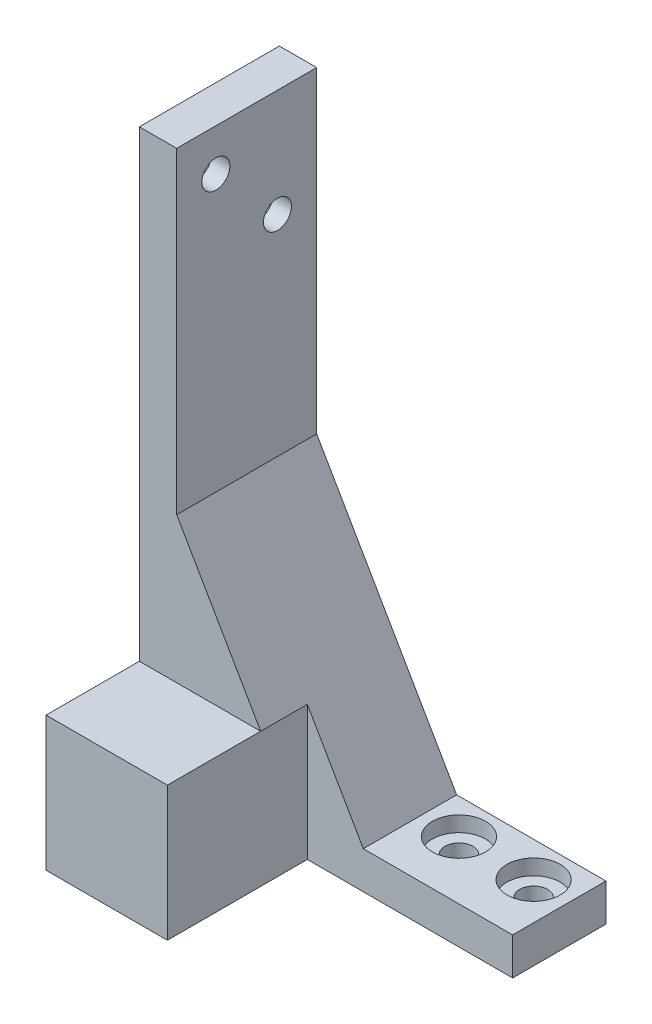
ISO-10303-21;
HEADER;
FILE_DESCRIPTION(('STEP AP214'),'2;1');
FILE_NAME('part.step','',(''),(''),'','','');
FILE_SCHEMA(('AUTOMOTIVE_DESIGN { 1 0 10303 214 1 1 1 1 }'));
ENDSEC;
DATA;
#1=APPLICATION_CONTEXT('core data for automotive mechanical design processes');
#2=APPLICATION_PROTOCOL_DEFINITION('international standard','automotive_design',2000,#1);
#3=PRODUCT_CONTEXT('',#1,'mechanical');
#4=PRODUCT('Part','Part','',(#3));
#5=PRODUCT_RELATED_PRODUCT_CATEGORY('part','',(#4));
#6=PRODUCT_DEFINITION_FORMATION('','',#4);
#7=PRODUCT_DEFINITION_CONTEXT('part definition',#1,'design');
#8=PRODUCT_DEFINITION('design','',#6,#7);
#9=PRODUCT_DEFINITION_SHAPE('','',#8);
#10=(LENGTH_UNIT() NAMED_UNIT(*) SI_UNIT(.MILLI.,.METRE.));
#11=(NAMED_UNIT(*) PLANE_ANGLE_UNIT() SI_UNIT($,.RADIAN.));
#12=(NAMED_UNIT(*) SI_UNIT($,.STERADIAN.) SOLID_ANGLE_UNIT());
#13=UNCERTAINTY_MEASURE_WITH_UNIT(LENGTH_MEASURE(1.E-05),#10,'distance_accuracy_value','');
#14=(GEOMETRIC_REPRESENTATION_CONTEXT(3) GLOBAL_UNCERTAINTY_ASSIGNED_CONTEXT((#13)) GLOBAL_UNIT_ASSIGNED_CONTEXT((#10,
#11,#12)) REPRESENTATION_CONTEXT('',''));
#15=CARTESIAN_POINT('',(0.,0.,0.));
#16=DIRECTION('',(0.,0.,1.));
#17=DIRECTION('',(1.,0.,0.));
#18=AXIS2_PLACEMENT_3D('',#15,#16,#17);
#19=CARTESIAN_POINT('',(17.5,4.,7.5));
#20=DIRECTION('',(0.,0.,-1.));
#21=DIRECTION('',(-1.,0.,0.));
#22=AXIS2_PLACEMENT_3D('',#19,#20,#21);
#23=PLANE('',#22);
#24=DIRECTION('',(-1.,0.,0.));
#25=VECTOR('',#24,1.);
#26=CARTESIAN_POINT('',(-4.49999999999999,14.4,7.5));
#27=LINE('',#26,#25);
#28=CARTESIAN_POINT('',(-4.49999999999999,14.4,7.5));
#29=VERTEX_POINT('',#28);
#30=CARTESIAN_POINT('',(-17.5,14.4,7.5));
#31=VERTEX_POINT('',#30);
#32=EDGE_CURVE('E152',#29,#31,#27,.T.);
#33=ORIENTED_EDGE('',*,*,#32,.F.);
#34=DIRECTION('',(-0.499722453489577,0.8661855860486,0.));
#35=VECTOR('',#34,1.);
#36=CARTESIAN_POINT('',(1.50000000000001,4.,7.5));
#37=LINE('',#36,#35);
#38=CARTESIAN_POINT('',(-13.5,30.,7.5));
#39=VERTEX_POINT('',#38);
#40=EDGE_CURVE('E202',#29,#39,#37,.T.);
#41=ORIENTED_EDGE('',*,*,#40,.T.);
#42=DIRECTION('',(0.,-1.,0.));
#43=VECTOR('',#42,1.);
#44=CARTESIAN_POINT('',(-13.5,64.,7.5));
#45=LINE('',#44,#43);
#46=CARTESIAN_POINT('',(-13.5,64.,7.5));
#47=VERTEX_POINT('',#46);
#48=EDGE_CURVE('E224',#47,#39,#45,.T.);
#49=ORIENTED_EDGE('',*,*,#48,.F.);
#50=DIRECTION('',(1.,0.,0.));
#51=VECTOR('',#50,1.);
#52=CARTESIAN_POINT('',(-17.5,64.,7.5));
#53=LINE('',#52,#51);
#54=CARTESIAN_POINT('',(-17.5,64.,7.5));
#55=VERTEX_POINT('',#54);
#56=EDGE_CURVE('E216',#55,#47,#53,.T.);
#57=ORIENTED_EDGE('',*,*,#56,.F.);
#58=DIRECTION('',(0.,-1.,0.));
#59=VECTOR('',#58,1.);
#60=CARTESIAN_POINT('',(-17.5,4.,7.5));
#61=LINE('',#60,#59);
#62=EDGE_CURVE('E244',#55,#31,#61,.T.);
#63=ORIENTED_EDGE('',*,*,#62,.T.);
#64=EDGE_LOOP('',(#33,#41,#49,#57,#63));
#65=FACE_BOUND('',#64,.T.);
#66=ADVANCED_FACE('F35',(#65),#23,.F.);
#67=CARTESIAN_POINT('',(-17.501,52.48,-3.29999999999999));
#68=DIRECTION('',(1.,0.,0.));
#69=DIRECTION('',(0.,0.,-1.));
#70=AXIS2_PLACEMENT_3D('',#67,#68,#69);
#71=CYLINDRICAL_SURFACE('',#70,1.5);
#72=CARTESIAN_POINT('',(-13.5,52.48,-3.3));
#73=DIRECTION('',(1.,0.,0.));
#74=DIRECTION('',(0.,0.,-1.));
#75=AXIS2_PLACEMENT_3D('',#72,#73,#74);
#76=CIRCLE('',#75,1.5);
#77=CARTESIAN_POINT('',(-13.5,52.48,-4.8));
#78=VERTEX_POINT('',#77);
#79=EDGE_CURVE('E178',#78,#78,#76,.T.);
#80=ORIENTED_EDGE('',*,*,#79,.T.);
#81=EDGE_LOOP('',(#80));
#82=FACE_BOUND('',#81,.T.);
#83=CARTESIAN_POINT('',(-15.5,52.48,-3.3));
#84=DIRECTION('',(-1.,0.,0.));
#85=DIRECTION('',(0.,0.,1.));
#86=AXIS2_PLACEMENT_3D('',#83,#84,#85);
#87=CIRCLE('',#86,1.5);
#88=CARTESIAN_POINT('',(-15.5,52.48,-1.79999999999999));
#89=VERTEX_POINT('',#88);
#90=EDGE_CURVE('E39',#89,#89,#87,.F.);
#91=ORIENTED_EDGE('',*,*,#90,.F.);
#92=EDGE_LOOP('',(#91));
#93=FACE_BOUND('',#92,.T.);
#94=ADVANCED_FACE('F258',(#82,#93),#71,.F.);
#95=CARTESIAN_POINT('',(-17.501,59.52,3.3));
#96=DIRECTION('',(1.,0.,0.));
#97=DIRECTION('',(0.,0.,-1.));
#98=AXIS2_PLACEMENT_3D('',#95,#96,#97);
#99=CYLINDRICAL_SURFACE('',#98,1.5);
#100=CARTESIAN_POINT('',(-13.5,59.52,3.3));
#101=DIRECTION('',(1.,0.,0.));
#102=DIRECTION('',(0.,0.,-1.));
#103=AXIS2_PLACEMENT_3D('',#100,#101,#102);
#104=CIRCLE('',#103,1.5);
#105=CARTESIAN_POINT('',(-13.5,59.52,1.8));
#106=VERTEX_POINT('',#105);
#107=EDGE_CURVE('E174',#106,#106,#104,.T.);
#108=ORIENTED_EDGE('',*,*,#107,.T.);
#109=EDGE_LOOP('',(#108));
#110=FACE_BOUND('',#109,.T.);
#111=CARTESIAN_POINT('',(-15.5,59.52,3.3));
#112=DIRECTION('',(-1.,0.,0.));
#113=DIRECTION('',(0.,0.,1.));
#114=AXIS2_PLACEMENT_3D('',#111,#112,#113);
#115=CIRCLE('',#114,1.5);
#116=CARTESIAN_POINT('',(-15.5,59.52,4.8));
#117=VERTEX_POINT('',#116);
#118=EDGE_CURVE('E168',#117,#117,#115,.F.);
#119=ORIENTED_EDGE('',*,*,#118,.F.);
#120=EDGE_LOOP('',(#119));
#121=FACE_BOUND('',#120,.T.);
#122=ADVANCED_FACE('F260',(#110,#121),#99,.F.);
#123=CARTESIAN_POINT('',(5.50000000000001,4.,-3.75));
#124=DIRECTION('',(0.,-1.,0.));
#125=DIRECTION('',(0.,0.,-1.));
#126=AXIS2_PLACEMENT_3D('',#123,#124,#125);
#127=CYLINDRICAL_SURFACE('',#126,1.5);
#128=CARTESIAN_POINT('',(5.50000000000001,0.,-3.75));
#129=DIRECTION('',(0.,1.,0.));
#130=DIRECTION('',(0.,0.,1.));
#131=AXIS2_PLACEMENT_3D('',#128,#129,#130);
#132=CIRCLE('',#131,1.5);
#133=CARTESIAN_POINT('',(5.50000000000001,0.,-2.25));
#134=VERTEX_POINT('',#133);
#135=EDGE_CURVE('E230',#134,#134,#132,.T.);
#136=ORIENTED_EDGE('',*,*,#135,.F.);
#137=EDGE_LOOP('',(#136));
#138=FACE_BOUND('',#137,.T.);
#139=CARTESIAN_POINT('',(5.50000000000001,2.35,-3.75));
#140=DIRECTION('',(0.,1.,0.));
#141=DIRECTION('',(0.,0.,1.));
#142=AXIS2_PLACEMENT_3D('',#139,#140,#141);
#143=CIRCLE('',#142,1.5);
#144=CARTESIAN_POINT('',(5.50000000000001,2.35,-2.25));
#145=VERTEX_POINT('',#144);
#146=EDGE_CURVE('E205',#145,#145,#143,.T.);
#147=ORIENTED_EDGE('',*,*,#146,.T.);
#148=EDGE_LOOP('',(#147));
#149=FACE_BOUND('',#148,.T.);
#150=ADVANCED_FACE('F267',(#138,#149),#127,.F.);
#151=CARTESIAN_POINT('',(13.5,4.,-3.75));
#152=DIRECTION('',(0.,-1.,0.));
#153=DIRECTION('',(0.,0.,-1.));
#154=AXIS2_PLACEMENT_3D('',#151,#152,#153);
#155=CYLINDRICAL_SURFACE('',#154,1.5);
#156=CARTESIAN_POINT('',(13.5,0.,-3.75));
#157=DIRECTION('',(0.,1.,0.));
#158=DIRECTION('',(0.,0.,1.));
#159=AXIS2_PLACEMENT_3D('',#156,#157,#158);
#160=CIRCLE('',#159,1.5);
#161=CARTESIAN_POINT('',(13.5,0.,-2.25));
#162=VERTEX_POINT('',#161);
#163=EDGE_CURVE('E227',#162,#162,#160,.T.);
#164=ORIENTED_EDGE('',*,*,#163,.F.);
#165=EDGE_LOOP('',(#164));
#166=FACE_BOUND('',#165,.T.);
#167=CARTESIAN_POINT('',(13.5,2.35,-3.75));
#168=DIRECTION('',(0.,1.,0.));
#169=DIRECTION('',(0.,0.,1.));
#170=AXIS2_PLACEMENT_3D('',#167,#168,#169);
#171=CIRCLE('',#170,1.5);
#172=CARTESIAN_POINT('',(13.5,2.35,-2.25));
#173=VERTEX_POINT('',#172);
#174=EDGE_CURVE('E193',#173,#173,#171,.T.);
#175=ORIENTED_EDGE('',*,*,#174,.T.);
#176=EDGE_LOOP('',(#175));
#177=FACE_BOUND('',#176,.T.);
#178=ADVANCED_FACE('F308',(#166,#177),#155,.F.);
#179=CARTESIAN_POINT('',(0.,4.,0.));
#180=DIRECTION('',(0.,1.,0.));
#181=DIRECTION('',(0.,0.,1.));
#182=AXIS2_PLACEMENT_3D('',#179,#180,#181);
#183=PLANE('',#182);
#184=DIRECTION('',(-1.,0.,0.));
#185=VECTOR('',#184,1.);
#186=CARTESIAN_POINT('',(0.,4.,2.5));
#187=LINE('',#186,#185);
#188=CARTESIAN_POINT('',(17.5,4.,2.5));
#189=VERTEX_POINT('',#188);
#190=CARTESIAN_POINT('',(1.50000000000001,4.,2.5));
#191=VERTEX_POINT('',#190);
#192=EDGE_CURVE('E187',#189,#191,#187,.T.);
#193=ORIENTED_EDGE('',*,*,#192,.F.);
#194=DIRECTION('',(0.,0.,-1.));
#195=VECTOR('',#194,1.);
#196=CARTESIAN_POINT('',(17.5,4.,7.5));
#197=LINE('',#196,#195);
#198=CARTESIAN_POINT('',(17.5,4.,-7.5));
#199=VERTEX_POINT('',#198);
#200=EDGE_CURVE('E60',#189,#199,#197,.T.);
#201=ORIENTED_EDGE('',*,*,#200,.T.);
#202=DIRECTION('',(-1.,0.,0.));
#203=VECTOR('',#202,1.);
#204=CARTESIAN_POINT('',(17.5,4.,-7.5));
#205=LINE('',#204,#203);
#206=CARTESIAN_POINT('',(1.50000000000001,4.,-7.5));
#207=VERTEX_POINT('',#206);
#208=EDGE_CURVE('E235',#199,#207,#205,.T.);
#209=ORIENTED_EDGE('',*,*,#208,.T.);
#210=DIRECTION('',(0.,0.,1.));
#211=VECTOR('',#210,1.);
#212=CARTESIAN_POINT('',(1.50000000000001,4.,-37.5166620396073));
#213=LINE('',#212,#211);
#214=EDGE_CURVE('E204',#207,#191,#213,.T.);
#215=ORIENTED_EDGE('',*,*,#214,.T.);
#216=EDGE_LOOP('',(#193,#201,#209,#215));
#217=FACE_BOUND('',#216,.T.);
#218=CARTESIAN_POINT('',(5.50000000000001,4.,-3.75));
#219=DIRECTION('',(0.,1.,0.));
#220=DIRECTION('',(0.,0.,1.));
#221=AXIS2_PLACEMENT_3D('',#218,#219,#220);
#222=CIRCLE('',#221,2.85);
#223=CARTESIAN_POINT('',(5.50000000000001,4.,-0.899999999999999));
#224=VERTEX_POINT('',#223);
#225=EDGE_CURVE('E194',#224,#224,#222,.T.);
#226=ORIENTED_EDGE('',*,*,#225,.F.);
#227=EDGE_LOOP('',(#226));
#228=FACE_BOUND('',#227,.T.);
#229=CARTESIAN_POINT('',(13.5,4.,-3.75));
#230=DIRECTION('',(0.,1.,0.));
#231=DIRECTION('',(0.,0.,1.));
#232=AXIS2_PLACEMENT_3D('',#229,#230,#231);
#233=CIRCLE('',#232,2.85);
#234=CARTESIAN_POINT('',(13.5,4.,-0.9));
#235=VERTEX_POINT('',#234);
#236=EDGE_CURVE('E189',#235,#235,#233,.T.);
#237=ORIENTED_EDGE('',*,*,#236,.F.);
#238=EDGE_LOOP('',(#237));
#239=FACE_BOUND('',#238,.T.);
#240=ADVANCED_FACE('F311',(#217,#228,#239),#183,.T.);
#241=CARTESIAN_POINT('',(0.,0.,0.));
#242=DIRECTION('',(0.,1.,0.));
#243=DIRECTION('',(0.,0.,1.));
#244=AXIS2_PLACEMENT_3D('',#241,#242,#243);
#245=PLANE('',#244);
#246=DIRECTION('',(0.,0.,-1.));
#247=VECTOR('',#246,1.);
#248=CARTESIAN_POINT('',(17.5,0.,7.5));
#249=LINE('',#248,#247);
#250=CARTESIAN_POINT('',(17.5,0.,2.5));
#251=VERTEX_POINT('',#250);
#252=CARTESIAN_POINT('',(17.5,0.,-7.5));
#253=VERTEX_POINT('',#252);
#254=EDGE_CURVE('E72',#251,#253,#249,.T.);
#255=ORIENTED_EDGE('',*,*,#254,.F.);
#256=DIRECTION('',(1.,0.,0.));
#257=VECTOR('',#256,1.);
#258=CARTESIAN_POINT('',(-4.49999999999999,0.,2.5));
#259=LINE('',#258,#257);
#260=CARTESIAN_POINT('',(-4.49999999999999,0.,2.5));
#261=VERTEX_POINT('',#260);
#262=EDGE_CURVE('E184',#261,#251,#259,.T.);
#263=ORIENTED_EDGE('',*,*,#262,.F.);
#264=DIRECTION('',(0.,0.,-1.));
#265=VECTOR('',#264,1.);
#266=CARTESIAN_POINT('',(-4.49999999999999,0.,7.5));
#267=LINE('',#266,#265);
#268=CARTESIAN_POINT('',(-4.49999999999998,0.,17.5));
#269=VERTEX_POINT('',#268);
#270=EDGE_CURVE('E181',#269,#261,#267,.T.);
#271=ORIENTED_EDGE('',*,*,#270,.F.);
#272=DIRECTION('',(1.,0.,0.));
#273=VECTOR('',#272,1.);
#274=CARTESIAN_POINT('',(-4.49999999999998,0.,17.5));
#275=LINE('',#274,#273);
#276=CARTESIAN_POINT('',(-17.5,0.,17.5));
#277=VERTEX_POINT('',#276);
#278=EDGE_CURVE('E151',#277,#269,#275,.T.);
#279=ORIENTED_EDGE('',*,*,#278,.F.);
#280=DIRECTION('',(0.,0.,1.));
#281=VECTOR('',#280,1.);
#282=CARTESIAN_POINT('',(-17.5,0.,7.5));
#283=LINE('',#282,#281);
#284=CARTESIAN_POINT('',(-17.5,0.,-7.49999999999999));
#285=VERTEX_POINT('',#284);
#286=EDGE_CURVE('E233',#285,#277,#283,.T.);
#287=ORIENTED_EDGE('',*,*,#286,.F.);
#288=DIRECTION('',(-1.,0.,0.));
#289=VECTOR('',#288,1.);
#290=CARTESIAN_POINT('',(17.5,0.,-7.5));
#291=LINE('',#290,#289);
#292=EDGE_CURVE('E236',#253,#285,#291,.T.);
#293=ORIENTED_EDGE('',*,*,#292,.F.);
#294=EDGE_LOOP('',(#255,#263,#271,#279,#287,#293));
#295=FACE_BOUND('',#294,.T.);
#296=ORIENTED_EDGE('',*,*,#135,.T.);
#297=EDGE_LOOP('',(#296));
#298=FACE_BOUND('',#297,.T.);
#299=ORIENTED_EDGE('',*,*,#163,.T.);
#300=EDGE_LOOP('',(#299));
#301=FACE_BOUND('',#300,.T.);
#302=ADVANCED_FACE('F318',(#295,#298,#301),#245,.F.);
#303=CARTESIAN_POINT('',(-17.5,4.,7.5));
#304=DIRECTION('',(1.,0.,0.));
#305=DIRECTION('',(0.,0.,-1.));
#306=AXIS2_PLACEMENT_3D('',#303,#304,#305);
#307=PLANE('',#306);
#308=CARTESIAN_POINT('',(-17.5,52.48,-3.29999999999999));
#309=DIRECTION('',(-1.,0.,0.));
#310=DIRECTION('',(0.,0.,1.));
#311=AXIS2_PLACEMENT_3D('',#308,#309,#310);
#312=CIRCLE('',#311,2.5);
#313=CARTESIAN_POINT('',(-17.5,52.48,-0.799999999999993));
#314=VERTEX_POINT('',#313);
#315=EDGE_CURVE('E169',#314,#314,#312,.T.);
#316=ORIENTED_EDGE('',*,*,#315,.F.);
#317=EDGE_LOOP('',(#316));
#318=FACE_BOUND('',#317,.T.);
#319=CARTESIAN_POINT('',(-17.5,59.52,3.3));
#320=DIRECTION('',(-1.,0.,0.));
#321=DIRECTION('',(0.,0.,1.));
#322=AXIS2_PLACEMENT_3D('',#319,#320,#321);
#323=CIRCLE('',#322,2.5);
#324=CARTESIAN_POINT('',(-17.5,59.52,5.8));
#325=VERTEX_POINT('',#324);
#326=EDGE_CURVE('E157',#325,#325,#323,.T.);
#327=ORIENTED_EDGE('',*,*,#326,.F.);
#328=EDGE_LOOP('',(#327));
#329=FACE_BOUND('',#328,.T.);
#330=ORIENTED_EDGE('',*,*,#286,.T.);
#331=DIRECTION('',(0.,-1.,0.));
#332=VECTOR('',#331,1.);
#333=CARTESIAN_POINT('',(-17.5,14.4,17.5));
#334=LINE('',#333,#332);
#335=CARTESIAN_POINT('',(-17.5,14.4,17.5));
#336=VERTEX_POINT('',#335);
#337=EDGE_CURVE('E144',#336,#277,#334,.T.);
#338=ORIENTED_EDGE('',*,*,#337,.F.);
#339=DIRECTION('',(0.,0.,-1.));
#340=VECTOR('',#339,1.);
#341=CARTESIAN_POINT('',(-17.5,14.4,17.5));
#342=LINE('',#341,#340);
#343=EDGE_CURVE('E140',#336,#31,#342,.T.);
#344=ORIENTED_EDGE('',*,*,#343,.T.);
#345=ORIENTED_EDGE('',*,*,#62,.F.);
#346=DIRECTION('',(0.,0.,1.));
#347=VECTOR('',#346,1.);
#348=CARTESIAN_POINT('',(-17.5,64.,-7.49999999999999));
#349=LINE('',#348,#347);
#350=CARTESIAN_POINT('',(-17.5,64.,-7.49999999999999));
#351=VERTEX_POINT('',#350);
#352=EDGE_CURVE('E213',#351,#55,#349,.T.);
#353=ORIENTED_EDGE('',*,*,#352,.F.);
#354=DIRECTION('',(0.,-1.,0.));
#355=VECTOR('',#354,1.);
#356=CARTESIAN_POINT('',(-17.5,4.,-7.49999999999999));
#357=LINE('',#356,#355);
#358=EDGE_CURVE('E79',#351,#285,#357,.T.);
#359=ORIENTED_EDGE('',*,*,#358,.T.);
#360=EDGE_LOOP('',(#330,#338,#344,#345,#353,#359));
#361=FACE_BOUND('',#360,.T.);
#362=ADVANCED_FACE('F37',(#318,#329,#361),#307,.F.);
#363=CARTESIAN_POINT('',(17.5,4.,7.5));
#364=DIRECTION('',(-1.,0.,0.));
#365=DIRECTION('',(0.,0.,1.));
#366=AXIS2_PLACEMENT_3D('',#363,#364,#365);
#367=PLANE('',#366);
#368=ORIENTED_EDGE('',*,*,#200,.F.);
#369=DIRECTION('',(0.,1.,0.));
#370=VECTOR('',#369,1.);
#371=CARTESIAN_POINT('',(17.5,0.,2.5));
#372=LINE('',#371,#370);
#373=EDGE_CURVE('E177',#251,#189,#372,.T.);
#374=ORIENTED_EDGE('',*,*,#373,.F.);
#375=ORIENTED_EDGE('',*,*,#254,.T.);
#376=DIRECTION('',(0.,-1.,0.));
#377=VECTOR('',#376,1.);
#378=CARTESIAN_POINT('',(17.5,4.,-7.5));
#379=LINE('',#378,#377);
#380=EDGE_CURVE('E242',#199,#253,#379,.T.);
#381=ORIENTED_EDGE('',*,*,#380,.F.);
#382=EDGE_LOOP('',(#368,#374,#375,#381));
#383=FACE_BOUND('',#382,.T.);
#384=ADVANCED_FACE('F324',(#383),#367,.F.);
#385=CARTESIAN_POINT('',(17.5,4.,-7.5));
#386=DIRECTION('',(0.,0.,1.));
#387=DIRECTION('',(1.,0.,0.));
#388=AXIS2_PLACEMENT_3D('',#385,#386,#387);
#389=PLANE('',#388);
#390=ORIENTED_EDGE('',*,*,#292,.T.);
#391=ORIENTED_EDGE('',*,*,#358,.F.);
#392=DIRECTION('',(-1.,0.,0.));
#393=VECTOR('',#392,1.);
#394=CARTESIAN_POINT('',(-17.5,64.,-7.49999999999999));
#395=LINE('',#394,#393);
#396=CARTESIAN_POINT('',(-13.5,64.,-7.49999999999999));
#397=VERTEX_POINT('',#396);
#398=EDGE_CURVE('E219',#397,#351,#395,.T.);
#399=ORIENTED_EDGE('',*,*,#398,.F.);
#400=DIRECTION('',(0.,-1.,0.));
#401=VECTOR('',#400,1.);
#402=CARTESIAN_POINT('',(-13.5,64.,-7.49999999999999));
#403=LINE('',#402,#401);
#404=CARTESIAN_POINT('',(-13.5,30.,-7.49999999999999));
#405=VERTEX_POINT('',#404);
#406=EDGE_CURVE('E221',#397,#405,#403,.T.);
#407=ORIENTED_EDGE('',*,*,#406,.T.);
#408=DIRECTION('',(0.499722453489577,-0.866185586048601,0.));
#409=VECTOR('',#408,1.);
#410=CARTESIAN_POINT('',(1.50000000000001,4.,-7.5));
#411=LINE('',#410,#409);
#412=EDGE_CURVE('E209',#405,#207,#411,.T.);
#413=ORIENTED_EDGE('',*,*,#412,.T.);
#414=ORIENTED_EDGE('',*,*,#208,.F.);
#415=ORIENTED_EDGE('',*,*,#380,.T.);
#416=EDGE_LOOP('',(#390,#391,#399,#407,#413,#414,#415));
#417=FACE_BOUND('',#416,.T.);
#418=ADVANCED_FACE('F306',(#417),#389,.F.);
#419=CARTESIAN_POINT('',(-13.5,64.,-7.49999999999999));
#420=DIRECTION('',(-1.,0.,0.));
#421=DIRECTION('',(0.,0.,1.));
#422=AXIS2_PLACEMENT_3D('',#419,#420,#421);
#423=PLANE('',#422);
#424=ORIENTED_EDGE('',*,*,#107,.F.);
#425=EDGE_LOOP('',(#424));
#426=FACE_BOUND('',#425,.T.);
#427=ORIENTED_EDGE('',*,*,#79,.F.);
#428=EDGE_LOOP('',(#427));
#429=FACE_BOUND('',#428,.T.);
#430=ORIENTED_EDGE('',*,*,#48,.T.);
#431=DIRECTION('',(0.,0.,1.));
#432=VECTOR('',#431,1.);
#433=CARTESIAN_POINT('',(-13.5,30.,-37.5166620396073));
#434=LINE('',#433,#432);
#435=EDGE_CURVE('E206',#405,#39,#434,.T.);
#436=ORIENTED_EDGE('',*,*,#435,.F.);
#437=ORIENTED_EDGE('',*,*,#406,.F.);
#438=DIRECTION('',(0.,0.,-1.));
#439=VECTOR('',#438,1.);
#440=CARTESIAN_POINT('',(-13.5,64.,-7.49999999999999));
#441=LINE('',#440,#439);
#442=EDGE_CURVE('E86',#47,#397,#441,.T.);
#443=ORIENTED_EDGE('',*,*,#442,.F.);
#444=EDGE_LOOP('',(#430,#436,#437,#443));
#445=FACE_BOUND('',#444,.T.);
#446=ADVANCED_FACE('F303',(#426,#429,#445),#423,.F.);
#447=CARTESIAN_POINT('',(0.,64.,0.));
#448=DIRECTION('',(0.,1.,0.));
#449=DIRECTION('',(0.,0.,1.));
#450=AXIS2_PLACEMENT_3D('',#447,#448,#449);
#451=PLANE('',#450);
#452=ORIENTED_EDGE('',*,*,#352,.T.);
#453=ORIENTED_EDGE('',*,*,#56,.T.);
#454=ORIENTED_EDGE('',*,*,#442,.T.);
#455=ORIENTED_EDGE('',*,*,#398,.T.);
#456=EDGE_LOOP('',(#452,#453,#454,#455));
#457=FACE_BOUND('',#456,.T.);
#458=ADVANCED_FACE('F299',(#457),#451,.T.);
#459=CARTESIAN_POINT('',(1.50000000000001,4.,-37.5166620396073));
#460=DIRECTION('',(0.866185586048601,0.499722453489577,0.));
#461=DIRECTION('',(-0.499722453489577,0.866185586048601,0.));
#462=AXIS2_PLACEMENT_3D('',#459,#460,#461);
#463=PLANE('',#462);
#464=DIRECTION('',(-0.499722453489577,0.866185586048601,0.));
#465=VECTOR('',#464,1.);
#466=CARTESIAN_POINT('',(1.50000000000001,4.,2.5));
#467=LINE('',#466,#465);
#468=CARTESIAN_POINT('',(-4.49999999999999,14.4,2.5));
#469=VERTEX_POINT('',#468);
#470=EDGE_CURVE('E11',#191,#469,#467,.T.);
#471=ORIENTED_EDGE('',*,*,#470,.F.);
#472=ORIENTED_EDGE('',*,*,#214,.F.);
#473=ORIENTED_EDGE('',*,*,#412,.F.);
#474=ORIENTED_EDGE('',*,*,#435,.T.);
#475=ORIENTED_EDGE('',*,*,#40,.F.);
#476=DIRECTION('',(0.,0.,1.));
#477=VECTOR('',#476,1.);
#478=CARTESIAN_POINT('',(-4.49999999999999,14.4,-37.5166620396073));
#479=LINE('',#478,#477);
#480=EDGE_CURVE('E44',#469,#29,#479,.T.);
#481=ORIENTED_EDGE('',*,*,#480,.F.);
#482=EDGE_LOOP('',(#471,#472,#473,#474,#475,#481));
#483=FACE_BOUND('',#482,.T.);
#484=ADVANCED_FACE('F295',(#483),#463,.T.);
#485=CARTESIAN_POINT('',(13.5,2.35,-3.75));
#486=DIRECTION('',(0.,1.,0.));
#487=DIRECTION('',(0.,0.,1.));
#488=AXIS2_PLACEMENT_3D('',#485,#486,#487);
#489=CYLINDRICAL_SURFACE('',#488,2.85);
#490=CARTESIAN_POINT('',(13.5,2.35,-3.75));
#491=DIRECTION('',(0.,1.,0.));
#492=DIRECTION('',(0.,0.,1.));
#493=AXIS2_PLACEMENT_3D('',#490,#491,#492);
#494=CIRCLE('',#493,2.85);
#495=CARTESIAN_POINT('',(13.5,2.35,-0.9));
#496=VERTEX_POINT('',#495);
#497=EDGE_CURVE('E197',#496,#496,#494,.T.);
#498=ORIENTED_EDGE('',*,*,#497,.F.);
#499=EDGE_LOOP('',(#498));
#500=FACE_BOUND('',#499,.T.);
#501=ORIENTED_EDGE('',*,*,#236,.T.);
#502=EDGE_LOOP('',(#501));
#503=FACE_BOUND('',#502,.T.);
#504=ADVANCED_FACE('F291',(#500,#503),#489,.F.);
#505=CARTESIAN_POINT('',(13.5,2.35,-3.75));
#506=DIRECTION('',(0.,1.,0.));
#507=DIRECTION('',(0.,0.,1.));
#508=AXIS2_PLACEMENT_3D('',#505,#506,#507);
#509=PLANE('',#508);
#510=ORIENTED_EDGE('',*,*,#174,.F.);
#511=EDGE_LOOP('',(#510));
#512=FACE_BOUND('',#511,.T.);
#513=ORIENTED_EDGE('',*,*,#497,.T.);
#514=EDGE_LOOP('',(#513));
#515=FACE_BOUND('',#514,.T.);
#516=ADVANCED_FACE('F287',(#512,#515),#509,.T.);
#517=CARTESIAN_POINT('',(5.50000000000001,2.35,-3.75));
#518=DIRECTION('',(0.,1.,0.));
#519=DIRECTION('',(0.,0.,1.));
#520=AXIS2_PLACEMENT_3D('',#517,#518,#519);
#521=CYLINDRICAL_SURFACE('',#520,2.85);
#522=CARTESIAN_POINT('',(5.50000000000001,2.35,-3.75));
#523=DIRECTION('',(0.,1.,0.));
#524=DIRECTION('',(0.,0.,1.));
#525=AXIS2_PLACEMENT_3D('',#522,#523,#524);
#526=CIRCLE('',#525,2.85);
#527=CARTESIAN_POINT('',(5.50000000000001,2.35,-0.899999999999999));
#528=VERTEX_POINT('',#527);
#529=EDGE_CURVE('E190',#528,#528,#526,.T.);
#530=ORIENTED_EDGE('',*,*,#529,.F.);
#531=EDGE_LOOP('',(#530));
#532=FACE_BOUND('',#531,.T.);
#533=ORIENTED_EDGE('',*,*,#225,.T.);
#534=EDGE_LOOP('',(#533));
#535=FACE_BOUND('',#534,.T.);
#536=ADVANCED_FACE('F283',(#532,#535),#521,.F.);
#537=CARTESIAN_POINT('',(5.50000000000001,2.35,-3.75));
#538=DIRECTION('',(0.,1.,0.));
#539=DIRECTION('',(0.,0.,1.));
#540=AXIS2_PLACEMENT_3D('',#537,#538,#539);
#541=PLANE('',#540);
#542=ORIENTED_EDGE('',*,*,#146,.F.);
#543=EDGE_LOOP('',(#542));
#544=FACE_BOUND('',#543,.T.);
#545=ORIENTED_EDGE('',*,*,#529,.T.);
#546=EDGE_LOOP('',(#545));
#547=FACE_BOUND('',#546,.T.);
#548=ADVANCED_FACE('F279',(#544,#547),#541,.T.);
#549=CARTESIAN_POINT('',(-4.49999999999999,0.,2.5));
#550=DIRECTION('',(0.,0.,-1.));
#551=DIRECTION('',(-1.,0.,0.));
#552=AXIS2_PLACEMENT_3D('',#549,#550,#551);
#553=PLANE('',#552);
#554=ORIENTED_EDGE('',*,*,#192,.T.);
#555=ORIENTED_EDGE('',*,*,#470,.T.);
#556=DIRECTION('',(0.,1.,0.));
#557=VECTOR('',#556,1.);
#558=CARTESIAN_POINT('',(-4.49999999999999,0.,2.5));
#559=LINE('',#558,#557);
#560=EDGE_CURVE('E52',#261,#469,#559,.T.);
#561=ORIENTED_EDGE('',*,*,#560,.F.);
#562=ORIENTED_EDGE('',*,*,#262,.T.);
#563=ORIENTED_EDGE('',*,*,#373,.T.);
#564=EDGE_LOOP('',(#554,#555,#561,#562,#563));
#565=FACE_BOUND('',#564,.T.);
#566=ADVANCED_FACE('F276',(#565),#553,.F.);
#567=CARTESIAN_POINT('',(-4.49999999999999,0.,0.));
#568=DIRECTION('',(-1.,0.,0.));
#569=DIRECTION('',(0.,0.,1.));
#570=AXIS2_PLACEMENT_3D('',#567,#568,#569);
#571=PLANE('',#570);
#572=ORIENTED_EDGE('',*,*,#480,.T.);
#573=DIRECTION('',(0.,0.,-1.));
#574=VECTOR('',#573,1.);
#575=CARTESIAN_POINT('',(-4.49999999999999,14.4,17.5));
#576=LINE('',#575,#574);
#577=CARTESIAN_POINT('',(-4.49999999999999,14.4,17.5));
#578=VERTEX_POINT('',#577);
#579=EDGE_CURVE('E138',#578,#29,#576,.T.);
#580=ORIENTED_EDGE('',*,*,#579,.F.);
#581=DIRECTION('',(0.,1.,0.));
#582=VECTOR('',#581,1.);
#583=CARTESIAN_POINT('',(-4.49999999999999,14.4,17.5));
#584=LINE('',#583,#582);
#585=EDGE_CURVE('E145',#269,#578,#584,.T.);
#586=ORIENTED_EDGE('',*,*,#585,.F.);
#587=ORIENTED_EDGE('',*,*,#270,.T.);
#588=ORIENTED_EDGE('',*,*,#560,.T.);
#589=EDGE_LOOP('',(#572,#580,#586,#587,#588));
#590=FACE_BOUND('',#589,.T.);
#591=ADVANCED_FACE('F154',(#590),#571,.F.);
#592=CARTESIAN_POINT('',(-15.5,59.52,3.3));
#593=DIRECTION('',(-1.,0.,0.));
#594=DIRECTION('',(0.,0.,1.));
#595=AXIS2_PLACEMENT_3D('',#592,#593,#594);
#596=PLANE('',#595);
#597=CARTESIAN_POINT('',(-15.5,59.52,3.3));
#598=DIRECTION('',(-1.,0.,0.));
#599=DIRECTION('',(0.,0.,1.));
#600=AXIS2_PLACEMENT_3D('',#597,#598,#599);
#601=CIRCLE('',#600,2.5);
#602=CARTESIAN_POINT('',(-15.5,59.52,5.8));
#603=VERTEX_POINT('',#602);
#604=EDGE_CURVE('E160',#603,#603,#601,.T.);
#605=ORIENTED_EDGE('',*,*,#604,.T.);
#606=EDGE_LOOP('',(#605));
#607=FACE_BOUND('',#606,.T.);
#608=ORIENTED_EDGE('',*,*,#118,.T.);
#609=EDGE_LOOP('',(#608));
#610=FACE_BOUND('',#609,.T.);
#611=ADVANCED_FACE('F275',(#607,#610),#596,.T.);
#612=CARTESIAN_POINT('',(-15.5,59.52,3.3));
#613=DIRECTION('',(-1.,0.,0.));
#614=DIRECTION('',(0.,0.,1.));
#615=AXIS2_PLACEMENT_3D('',#612,#613,#614);
#616=CYLINDRICAL_SURFACE('',#615,2.5);
#617=ORIENTED_EDGE('',*,*,#604,.F.);
#618=EDGE_LOOP('',(#617));
#619=FACE_BOUND('',#618,.T.);
#620=ORIENTED_EDGE('',*,*,#326,.T.);
#621=EDGE_LOOP('',(#620));
#622=FACE_BOUND('',#621,.T.);
#623=ADVANCED_FACE('F368',(#619,#622),#616,.F.);
#624=CARTESIAN_POINT('',(-15.5,52.48,-3.29999999999999));
#625=DIRECTION('',(-1.,0.,0.));
#626=DIRECTION('',(0.,0.,1.));
#627=AXIS2_PLACEMENT_3D('',#624,#625,#626);
#628=PLANE('',#627);
#629=CARTESIAN_POINT('',(-15.5,52.48,-3.29999999999999));
#630=DIRECTION('',(-1.,0.,0.));
#631=DIRECTION('',(0.,0.,1.));
#632=AXIS2_PLACEMENT_3D('',#629,#630,#631);
#633=CIRCLE('',#632,2.5);
#634=CARTESIAN_POINT('',(-15.5,52.48,-0.799999999999993));
#635=VERTEX_POINT('',#634);
#636=EDGE_CURVE('E165',#635,#635,#633,.T.);
#637=ORIENTED_EDGE('',*,*,#636,.T.);
#638=EDGE_LOOP('',(#637));
#639=FACE_BOUND('',#638,.T.);
#640=ORIENTED_EDGE('',*,*,#90,.T.);
#641=EDGE_LOOP('',(#640));
#642=FACE_BOUND('',#641,.T.);
#643=ADVANCED_FACE('F256',(#639,#642),#628,.T.);
#644=CARTESIAN_POINT('',(-15.5,52.48,-3.29999999999999));
#645=DIRECTION('',(-1.,0.,0.));
#646=DIRECTION('',(0.,0.,1.));
#647=AXIS2_PLACEMENT_3D('',#644,#645,#646);
#648=CYLINDRICAL_SURFACE('',#647,2.5);
#649=ORIENTED_EDGE('',*,*,#636,.F.);
#650=EDGE_LOOP('',(#649));
#651=FACE_BOUND('',#650,.T.);
#652=ORIENTED_EDGE('',*,*,#315,.T.);
#653=EDGE_LOOP('',(#652));
#654=FACE_BOUND('',#653,.T.);
#655=ADVANCED_FACE('F375',(#651,#654),#648,.F.);
#656=CARTESIAN_POINT('',(-4.49999999999999,14.4,17.5));
#657=DIRECTION('',(0.,-1.,0.));
#658=DIRECTION('',(1.,0.,0.));
#659=AXIS2_PLACEMENT_3D('',#656,#657,#658);
#660=PLANE('',#659);
#661=ORIENTED_EDGE('',*,*,#32,.T.);
#662=ORIENTED_EDGE('',*,*,#343,.F.);
#663=DIRECTION('',(-1.,0.,0.));
#664=VECTOR('',#663,1.);
#665=CARTESIAN_POINT('',(-4.49999999999999,14.4,17.5));
#666=LINE('',#665,#664);
#667=EDGE_CURVE('E133',#578,#336,#666,.T.);
#668=ORIENTED_EDGE('',*,*,#667,.F.);
#669=ORIENTED_EDGE('',*,*,#579,.T.);
#670=EDGE_LOOP('',(#661,#662,#668,#669));
#671=FACE_BOUND('',#670,.T.);
#672=ADVANCED_FACE('F136',(#671),#660,.F.);
#673=CARTESIAN_POINT('',(0.,0.,17.5));
#674=DIRECTION('',(0.,0.,-1.));
#675=DIRECTION('',(-1.,0.,0.));
#676=AXIS2_PLACEMENT_3D('',#673,#674,#675);
#677=PLANE('',#676);
#678=ORIENTED_EDGE('',*,*,#585,.T.);
#679=ORIENTED_EDGE('',*,*,#667,.T.);
#680=ORIENTED_EDGE('',*,*,#337,.T.);
#681=ORIENTED_EDGE('',*,*,#278,.T.);
#682=EDGE_LOOP('',(#678,#679,#680,#681));
#683=FACE_BOUND('',#682,.T.);
#684=ADVANCED_FACE('F149',(#683),#677,.F.);
#685=CLOSED_SHELL('',(#66,#94,#122,#150,#178,#240,#302,#362,#384,#418,#446,#458,#484,#504,#516,
#536,#548,#566,#591,#611,#623,#643,#655,#672,#684));
#686=MANIFOLD_SOLID_BREP('B2',#685);
#687=ADVANCED_BREP_SHAPE_REPRESENTATION('',(#18,#686),#14);
#688=SHAPE_DEFINITION_REPRESENTATION(#9,#687);
ENDSEC;
END-ISO-10303-21;
